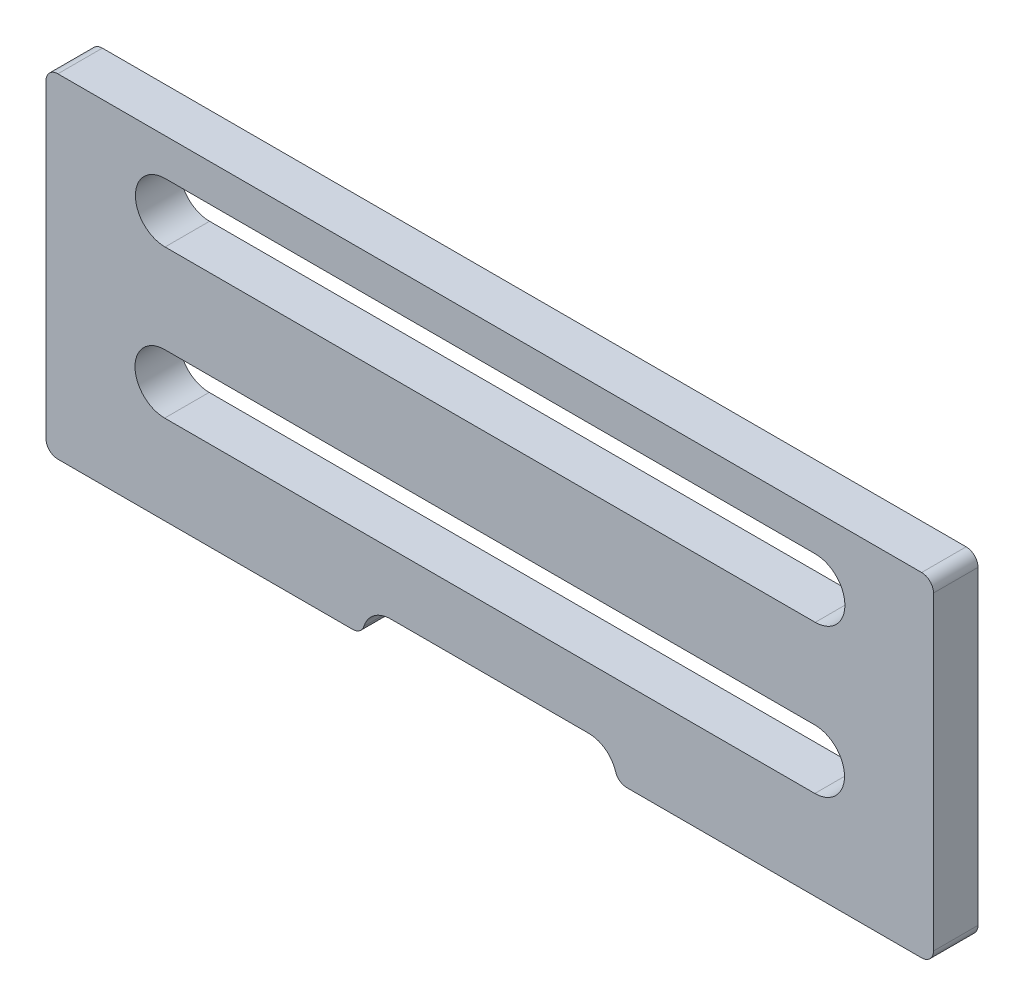
ISO-10303-21;
HEADER;
FILE_DESCRIPTION(('STEP AP214'),'2;1');
FILE_NAME('part.step','',(''),(''),'','','');
FILE_SCHEMA(('AUTOMOTIVE_DESIGN { 1 0 10303 214 1 1 1 1 }'));
ENDSEC;
DATA;
#1=APPLICATION_CONTEXT('core data for automotive mechanical design processes');
#2=APPLICATION_PROTOCOL_DEFINITION('international standard','automotive_design',2000,#1);
#3=PRODUCT_CONTEXT('',#1,'mechanical');
#4=PRODUCT('Part','Part','',(#3));
#5=PRODUCT_RELATED_PRODUCT_CATEGORY('part','',(#4));
#6=PRODUCT_DEFINITION_FORMATION('','',#4);
#7=PRODUCT_DEFINITION_CONTEXT('part definition',#1,'design');
#8=PRODUCT_DEFINITION('design','',#6,#7);
#9=PRODUCT_DEFINITION_SHAPE('','',#8);
#10=(LENGTH_UNIT() NAMED_UNIT(*) SI_UNIT(.MILLI.,.METRE.));
#11=(NAMED_UNIT(*) PLANE_ANGLE_UNIT() SI_UNIT($,.RADIAN.));
#12=(NAMED_UNIT(*) SI_UNIT($,.STERADIAN.) SOLID_ANGLE_UNIT());
#13=UNCERTAINTY_MEASURE_WITH_UNIT(LENGTH_MEASURE(1.E-05),#10,'distance_accuracy_value','');
#14=(GEOMETRIC_REPRESENTATION_CONTEXT(3) GLOBAL_UNCERTAINTY_ASSIGNED_CONTEXT((#13)) GLOBAL_UNIT_ASSIGNED_CONTEXT((#10,
#11,#12)) REPRESENTATION_CONTEXT('',''));
#15=CARTESIAN_POINT('',(0.,0.,0.));
#16=DIRECTION('',(0.,0.,1.));
#17=DIRECTION('',(1.,0.,0.));
#18=AXIS2_PLACEMENT_3D('',#15,#16,#17);
#19=CARTESIAN_POINT('',(-46.21916,-16.589375,0.));
#20=DIRECTION('',(0.,0.,1.));
#21=DIRECTION('',(1.,0.,0.));
#22=AXIS2_PLACEMENT_3D('',#19,#20,#21);
#23=CYLINDRICAL_SURFACE('',#22,1.27);
#24=CARTESIAN_POINT('',(-46.21916,-16.589375,4.7625));
#25=DIRECTION('',(0.,0.,1.));
#26=DIRECTION('',(1.,0.,0.));
#27=AXIS2_PLACEMENT_3D('',#24,#25,#26);
#28=CIRCLE('',#27,1.27);
#29=CARTESIAN_POINT('',(-47.48916,-16.589375,4.7625));
#30=VERTEX_POINT('',#29);
#31=CARTESIAN_POINT('',(-46.21916,-17.859375,4.7625));
#32=VERTEX_POINT('',#31);
#33=EDGE_CURVE('E284',#30,#32,#28,.T.);
#34=ORIENTED_EDGE('',*,*,#33,.F.);
#35=DIRECTION('',(0.,0.,1.));
#36=VECTOR('',#35,1.);
#37=CARTESIAN_POINT('',(-47.48916,-16.589375,0.));
#38=LINE('',#37,#36);
#39=CARTESIAN_POINT('',(-47.48916,-16.589375,0.));
#40=VERTEX_POINT('',#39);
#41=EDGE_CURVE('E11',#40,#30,#38,.T.);
#42=ORIENTED_EDGE('',*,*,#41,.F.);
#43=CARTESIAN_POINT('',(-46.21916,-16.589375,0.));
#44=DIRECTION('',(0.,0.,1.));
#45=DIRECTION('',(1.,0.,0.));
#46=AXIS2_PLACEMENT_3D('',#43,#44,#45);
#47=CIRCLE('',#46,1.27);
#48=CARTESIAN_POINT('',(-46.21916,-17.859375,0.));
#49=VERTEX_POINT('',#48);
#50=EDGE_CURVE('E294',#40,#49,#47,.T.);
#51=ORIENTED_EDGE('',*,*,#50,.T.);
#52=DIRECTION('',(0.,0.,1.));
#53=VECTOR('',#52,1.);
#54=CARTESIAN_POINT('',(-46.21916,-17.859375,0.));
#55=LINE('',#54,#53);
#56=EDGE_CURVE('E54',#49,#32,#55,.T.);
#57=ORIENTED_EDGE('',*,*,#56,.T.);
#58=EDGE_LOOP('',(#34,#42,#51,#57));
#59=FACE_BOUND('',#58,.T.);
#60=ADVANCED_FACE('F51',(#59),#23,.T.);
#61=CARTESIAN_POINT('',(-47.48916,16.589375,0.));
#62=DIRECTION('',(-1.,0.,0.));
#63=DIRECTION('',(0.,0.,1.));
#64=AXIS2_PLACEMENT_3D('',#61,#62,#63);
#65=PLANE('',#64);
#66=DIRECTION('',(0.,-1.,0.));
#67=VECTOR('',#66,1.);
#68=CARTESIAN_POINT('',(-47.48916,16.589375,4.7625));
#69=LINE('',#68,#67);
#70=CARTESIAN_POINT('',(-47.48916,16.589375,4.7625));
#71=VERTEX_POINT('',#70);
#72=EDGE_CURVE('E299',#71,#30,#69,.T.);
#73=ORIENTED_EDGE('',*,*,#72,.F.);
#74=DIRECTION('',(0.,0.,1.));
#75=VECTOR('',#74,1.);
#76=CARTESIAN_POINT('',(-47.48916,16.589375,0.));
#77=LINE('',#76,#75);
#78=CARTESIAN_POINT('',(-47.48916,16.589375,0.));
#79=VERTEX_POINT('',#78);
#80=EDGE_CURVE('E60',#79,#71,#77,.T.);
#81=ORIENTED_EDGE('',*,*,#80,.F.);
#82=DIRECTION('',(0.,-1.,0.));
#83=VECTOR('',#82,1.);
#84=CARTESIAN_POINT('',(-47.48916,16.589375,0.));
#85=LINE('',#84,#83);
#86=EDGE_CURVE('E347',#79,#40,#85,.T.);
#87=ORIENTED_EDGE('',*,*,#86,.T.);
#88=ORIENTED_EDGE('',*,*,#41,.T.);
#89=EDGE_LOOP('',(#73,#81,#87,#88));
#90=FACE_BOUND('',#89,.T.);
#91=ADVANCED_FACE('F452',(#90),#65,.T.);
#92=CARTESIAN_POINT('',(-46.21916,16.589375,0.));
#93=DIRECTION('',(0.,0.,1.));
#94=DIRECTION('',(1.,0.,0.));
#95=AXIS2_PLACEMENT_3D('',#92,#93,#94);
#96=CYLINDRICAL_SURFACE('',#95,1.27);
#97=CARTESIAN_POINT('',(-46.21916,16.589375,4.7625));
#98=DIRECTION('',(0.,0.,1.));
#99=DIRECTION('',(1.,0.,0.));
#100=AXIS2_PLACEMENT_3D('',#97,#98,#99);
#101=CIRCLE('',#100,1.27);
#102=CARTESIAN_POINT('',(-46.21916,17.859375,4.7625));
#103=VERTEX_POINT('',#102);
#104=EDGE_CURVE('E398',#103,#71,#101,.T.);
#105=ORIENTED_EDGE('',*,*,#104,.F.);
#106=DIRECTION('',(0.,0.,1.));
#107=VECTOR('',#106,1.);
#108=CARTESIAN_POINT('',(-46.21916,17.859375,0.));
#109=LINE('',#108,#107);
#110=CARTESIAN_POINT('',(-46.21916,17.859375,0.));
#111=VERTEX_POINT('',#110);
#112=EDGE_CURVE('E407',#111,#103,#109,.T.);
#113=ORIENTED_EDGE('',*,*,#112,.F.);
#114=CARTESIAN_POINT('',(-46.21916,16.589375,0.));
#115=DIRECTION('',(0.,0.,1.));
#116=DIRECTION('',(1.,0.,0.));
#117=AXIS2_PLACEMENT_3D('',#114,#115,#116);
#118=CIRCLE('',#117,1.27);
#119=EDGE_CURVE('E343',#111,#79,#118,.T.);
#120=ORIENTED_EDGE('',*,*,#119,.T.);
#121=ORIENTED_EDGE('',*,*,#80,.T.);
#122=EDGE_LOOP('',(#105,#113,#120,#121));
#123=FACE_BOUND('',#122,.T.);
#124=ADVANCED_FACE('F496',(#123),#96,.T.);
#125=CARTESIAN_POINT('',(46.21916,17.859375,0.));
#126=DIRECTION('',(0.,1.,0.));
#127=DIRECTION('',(0.,0.,1.));
#128=AXIS2_PLACEMENT_3D('',#125,#126,#127);
#129=PLANE('',#128);
#130=DIRECTION('',(-1.,0.,0.));
#131=VECTOR('',#130,1.);
#132=CARTESIAN_POINT('',(46.21916,17.859375,4.7625));
#133=LINE('',#132,#131);
#134=CARTESIAN_POINT('',(46.21916,17.859375,4.7625));
#135=VERTEX_POINT('',#134);
#136=EDGE_CURVE('E394',#135,#103,#133,.T.);
#137=ORIENTED_EDGE('',*,*,#136,.F.);
#138=DIRECTION('',(0.,0.,1.));
#139=VECTOR('',#138,1.);
#140=CARTESIAN_POINT('',(46.21916,17.859375,0.));
#141=LINE('',#140,#139);
#142=CARTESIAN_POINT('',(46.21916,17.859375,0.));
#143=VERTEX_POINT('',#142);
#144=EDGE_CURVE('E410',#143,#135,#141,.T.);
#145=ORIENTED_EDGE('',*,*,#144,.F.);
#146=DIRECTION('',(-1.,0.,0.));
#147=VECTOR('',#146,1.);
#148=CARTESIAN_POINT('',(46.21916,17.859375,0.));
#149=LINE('',#148,#147);
#150=EDGE_CURVE('E339',#143,#111,#149,.T.);
#151=ORIENTED_EDGE('',*,*,#150,.T.);
#152=ORIENTED_EDGE('',*,*,#112,.T.);
#153=EDGE_LOOP('',(#137,#145,#151,#152));
#154=FACE_BOUND('',#153,.T.);
#155=ADVANCED_FACE('F494',(#154),#129,.T.);
#156=CARTESIAN_POINT('',(46.21916,16.589375,0.));
#157=DIRECTION('',(0.,0.,1.));
#158=DIRECTION('',(1.,0.,0.));
#159=AXIS2_PLACEMENT_3D('',#156,#157,#158);
#160=CYLINDRICAL_SURFACE('',#159,1.27);
#161=CARTESIAN_POINT('',(46.21916,16.589375,4.7625));
#162=DIRECTION('',(0.,0.,1.));
#163=DIRECTION('',(1.,0.,0.));
#164=AXIS2_PLACEMENT_3D('',#161,#162,#163);
#165=CIRCLE('',#164,1.27);
#166=CARTESIAN_POINT('',(47.48916,16.589375,4.7625));
#167=VERTEX_POINT('',#166);
#168=EDGE_CURVE('E390',#167,#135,#165,.T.);
#169=ORIENTED_EDGE('',*,*,#168,.F.);
#170=DIRECTION('',(0.,0.,1.));
#171=VECTOR('',#170,1.);
#172=CARTESIAN_POINT('',(47.48916,16.589375,0.));
#173=LINE('',#172,#171);
#174=CARTESIAN_POINT('',(47.48916,16.589375,0.));
#175=VERTEX_POINT('',#174);
#176=EDGE_CURVE('E413',#175,#167,#173,.T.);
#177=ORIENTED_EDGE('',*,*,#176,.F.);
#178=CARTESIAN_POINT('',(46.21916,16.589375,0.));
#179=DIRECTION('',(0.,0.,1.));
#180=DIRECTION('',(1.,0.,0.));
#181=AXIS2_PLACEMENT_3D('',#178,#179,#180);
#182=CIRCLE('',#181,1.27);
#183=EDGE_CURVE('E335',#175,#143,#182,.T.);
#184=ORIENTED_EDGE('',*,*,#183,.T.);
#185=ORIENTED_EDGE('',*,*,#144,.T.);
#186=EDGE_LOOP('',(#169,#177,#184,#185));
#187=FACE_BOUND('',#186,.T.);
#188=ADVANCED_FACE('F490',(#187),#160,.T.);
#189=CARTESIAN_POINT('',(47.48916,-16.589375,0.));
#190=DIRECTION('',(1.,0.,0.));
#191=DIRECTION('',(0.,0.,-1.));
#192=AXIS2_PLACEMENT_3D('',#189,#190,#191);
#193=PLANE('',#192);
#194=DIRECTION('',(0.,1.,0.));
#195=VECTOR('',#194,1.);
#196=CARTESIAN_POINT('',(47.48916,-16.589375,4.7625));
#197=LINE('',#196,#195);
#198=CARTESIAN_POINT('',(47.48916,-16.589375,4.7625));
#199=VERTEX_POINT('',#198);
#200=EDGE_CURVE('E386',#199,#167,#197,.T.);
#201=ORIENTED_EDGE('',*,*,#200,.F.);
#202=DIRECTION('',(0.,0.,1.));
#203=VECTOR('',#202,1.);
#204=CARTESIAN_POINT('',(47.48916,-16.589375,0.));
#205=LINE('',#204,#203);
#206=CARTESIAN_POINT('',(47.48916,-16.589375,0.));
#207=VERTEX_POINT('',#206);
#208=EDGE_CURVE('E416',#207,#199,#205,.T.);
#209=ORIENTED_EDGE('',*,*,#208,.F.);
#210=DIRECTION('',(0.,1.,0.));
#211=VECTOR('',#210,1.);
#212=CARTESIAN_POINT('',(47.48916,-16.589375,0.));
#213=LINE('',#212,#211);
#214=EDGE_CURVE('E331',#207,#175,#213,.T.);
#215=ORIENTED_EDGE('',*,*,#214,.T.);
#216=ORIENTED_EDGE('',*,*,#176,.T.);
#217=EDGE_LOOP('',(#201,#209,#215,#216));
#218=FACE_BOUND('',#217,.T.);
#219=ADVANCED_FACE('F486',(#218),#193,.T.);
#220=CARTESIAN_POINT('',(46.21916,-16.589375,0.));
#221=DIRECTION('',(0.,0.,1.));
#222=DIRECTION('',(1.,0.,0.));
#223=AXIS2_PLACEMENT_3D('',#220,#221,#222);
#224=CYLINDRICAL_SURFACE('',#223,1.27);
#225=CARTESIAN_POINT('',(46.21916,-16.589375,4.7625));
#226=DIRECTION('',(0.,0.,1.));
#227=DIRECTION('',(1.,0.,0.));
#228=AXIS2_PLACEMENT_3D('',#225,#226,#227);
#229=CIRCLE('',#228,1.27);
#230=CARTESIAN_POINT('',(46.21916,-17.859375,4.7625));
#231=VERTEX_POINT('',#230);
#232=EDGE_CURVE('E382',#231,#199,#229,.T.);
#233=ORIENTED_EDGE('',*,*,#232,.F.);
#234=DIRECTION('',(0.,0.,1.));
#235=VECTOR('',#234,1.);
#236=CARTESIAN_POINT('',(46.21916,-17.859375,0.));
#237=LINE('',#236,#235);
#238=CARTESIAN_POINT('',(46.21916,-17.859375,0.));
#239=VERTEX_POINT('',#238);
#240=EDGE_CURVE('E419',#239,#231,#237,.T.);
#241=ORIENTED_EDGE('',*,*,#240,.F.);
#242=CARTESIAN_POINT('',(46.21916,-16.589375,0.));
#243=DIRECTION('',(0.,0.,1.));
#244=DIRECTION('',(1.,0.,0.));
#245=AXIS2_PLACEMENT_3D('',#242,#243,#244);
#246=CIRCLE('',#245,1.27);
#247=EDGE_CURVE('E327',#239,#207,#246,.T.);
#248=ORIENTED_EDGE('',*,*,#247,.T.);
#249=ORIENTED_EDGE('',*,*,#208,.T.);
#250=EDGE_LOOP('',(#233,#241,#248,#249));
#251=FACE_BOUND('',#250,.T.);
#252=ADVANCED_FACE('F482',(#251),#224,.T.);
#253=CARTESIAN_POINT('',(14.6767634221279,-17.859375,0.));
#254=DIRECTION('',(0.,-1.,0.));
#255=DIRECTION('',(0.,0.,-1.));
#256=AXIS2_PLACEMENT_3D('',#253,#254,#255);
#257=PLANE('',#256);
#258=DIRECTION('',(1.,0.,0.));
#259=VECTOR('',#258,1.);
#260=CARTESIAN_POINT('',(14.6767634221279,-17.859375,4.7625));
#261=LINE('',#260,#259);
#262=CARTESIAN_POINT('',(14.6767634221279,-17.859375,4.7625));
#263=VERTEX_POINT('',#262);
#264=EDGE_CURVE('E378',#263,#231,#261,.T.);
#265=ORIENTED_EDGE('',*,*,#264,.F.);
#266=DIRECTION('',(0.,0.,1.));
#267=VECTOR('',#266,1.);
#268=CARTESIAN_POINT('',(14.6767634221279,-17.859375,0.));
#269=LINE('',#268,#267);
#270=CARTESIAN_POINT('',(14.6767634221279,-17.859375,0.));
#271=VERTEX_POINT('',#270);
#272=EDGE_CURVE('E422',#271,#263,#269,.T.);
#273=ORIENTED_EDGE('',*,*,#272,.F.);
#274=DIRECTION('',(1.,0.,0.));
#275=VECTOR('',#274,1.);
#276=CARTESIAN_POINT('',(14.6767634221279,-17.859375,0.));
#277=LINE('',#276,#275);
#278=EDGE_CURVE('E323',#271,#239,#277,.T.);
#279=ORIENTED_EDGE('',*,*,#278,.T.);
#280=ORIENTED_EDGE('',*,*,#240,.T.);
#281=EDGE_LOOP('',(#265,#273,#279,#280));
#282=FACE_BOUND('',#281,.T.);
#283=ADVANCED_FACE('F478',(#282),#257,.T.);
#284=CARTESIAN_POINT('',(14.6767634221279,-16.589375,0.));
#285=DIRECTION('',(0.,0.,1.));
#286=DIRECTION('',(1.,0.,0.));
#287=AXIS2_PLACEMENT_3D('',#284,#285,#286);
#288=CYLINDRICAL_SURFACE('',#287,1.27000000000001);
#289=CARTESIAN_POINT('',(14.6767634221279,-16.589375,4.7625));
#290=DIRECTION('',(0.,0.,1.));
#291=DIRECTION('',(1.,0.,0.));
#292=AXIS2_PLACEMENT_3D('',#289,#290,#291);
#293=CIRCLE('',#292,1.27000000000001);
#294=CARTESIAN_POINT('',(13.4642365963428,-16.9671033372365,4.7625));
#295=VERTEX_POINT('',#294);
#296=EDGE_CURVE('E374',#295,#263,#293,.T.);
#297=ORIENTED_EDGE('',*,*,#296,.F.);
#298=DIRECTION('',(0.,0.,1.));
#299=VECTOR('',#298,1.);
#300=CARTESIAN_POINT('',(13.4642365963428,-16.9671033372365,0.));
#301=LINE('',#300,#299);
#302=CARTESIAN_POINT('',(13.4642365963428,-16.9671033372365,0.));
#303=VERTEX_POINT('',#302);
#304=EDGE_CURVE('E425',#303,#295,#301,.T.);
#305=ORIENTED_EDGE('',*,*,#304,.F.);
#306=CARTESIAN_POINT('',(14.6767634221279,-16.589375,0.));
#307=DIRECTION('',(0.,0.,1.));
#308=DIRECTION('',(1.,0.,0.));
#309=AXIS2_PLACEMENT_3D('',#306,#307,#308);
#310=CIRCLE('',#309,1.27000000000001);
#311=EDGE_CURVE('E319',#303,#271,#310,.T.);
#312=ORIENTED_EDGE('',*,*,#311,.T.);
#313=ORIENTED_EDGE('',*,*,#272,.T.);
#314=EDGE_LOOP('',(#297,#305,#312,#313));
#315=FACE_BOUND('',#314,.T.);
#316=ADVANCED_FACE('F474',(#315),#288,.T.);
#317=CARTESIAN_POINT('',(10.6,-17.859375,0.));
#318=DIRECTION('',(0.,0.,1.));
#319=DIRECTION('',(1.,0.,0.));
#320=AXIS2_PLACEMENT_3D('',#317,#318,#319);
#321=CYLINDRICAL_SURFACE('',#320,2.99999999999999);
#322=CARTESIAN_POINT('',(10.6,-17.859375,4.7625));
#323=DIRECTION('',(0.,0.,-1.));
#324=DIRECTION('',(-1.,0.,0.));
#325=AXIS2_PLACEMENT_3D('',#322,#323,#324);
#326=CIRCLE('',#325,2.99999999999999);
#327=CARTESIAN_POINT('',(10.6,-14.859375,4.7625));
#328=VERTEX_POINT('',#327);
#329=EDGE_CURVE('E370',#328,#295,#326,.T.);
#330=ORIENTED_EDGE('',*,*,#329,.F.);
#331=DIRECTION('',(0.,0.,1.));
#332=VECTOR('',#331,1.);
#333=CARTESIAN_POINT('',(10.6,-14.859375,0.));
#334=LINE('',#333,#332);
#335=CARTESIAN_POINT('',(10.6,-14.859375,0.));
#336=VERTEX_POINT('',#335);
#337=EDGE_CURVE('E428',#336,#328,#334,.T.);
#338=ORIENTED_EDGE('',*,*,#337,.F.);
#339=CARTESIAN_POINT('',(10.6,-17.859375,0.));
#340=DIRECTION('',(0.,0.,-1.));
#341=DIRECTION('',(-1.,0.,0.));
#342=AXIS2_PLACEMENT_3D('',#339,#340,#341);
#343=CIRCLE('',#342,2.99999999999999);
#344=EDGE_CURVE('E315',#336,#303,#343,.T.);
#345=ORIENTED_EDGE('',*,*,#344,.T.);
#346=ORIENTED_EDGE('',*,*,#304,.T.);
#347=EDGE_LOOP('',(#330,#338,#345,#346));
#348=FACE_BOUND('',#347,.T.);
#349=ADVANCED_FACE('F470',(#348),#321,.F.);
#350=CARTESIAN_POINT('',(-10.6,-14.859375,0.));
#351=DIRECTION('',(0.,-1.,0.));
#352=DIRECTION('',(0.,0.,-1.));
#353=AXIS2_PLACEMENT_3D('',#350,#351,#352);
#354=PLANE('',#353);
#355=DIRECTION('',(1.,0.,0.));
#356=VECTOR('',#355,1.);
#357=CARTESIAN_POINT('',(-10.6,-14.859375,4.7625));
#358=LINE('',#357,#356);
#359=CARTESIAN_POINT('',(-10.6,-14.859375,4.7625));
#360=VERTEX_POINT('',#359);
#361=EDGE_CURVE('E366',#360,#328,#358,.T.);
#362=ORIENTED_EDGE('',*,*,#361,.F.);
#363=DIRECTION('',(0.,0.,1.));
#364=VECTOR('',#363,1.);
#365=CARTESIAN_POINT('',(-10.6,-14.859375,0.));
#366=LINE('',#365,#364);
#367=CARTESIAN_POINT('',(-10.6,-14.859375,0.));
#368=VERTEX_POINT('',#367);
#369=EDGE_CURVE('E431',#368,#360,#366,.T.);
#370=ORIENTED_EDGE('',*,*,#369,.F.);
#371=DIRECTION('',(1.,0.,0.));
#372=VECTOR('',#371,1.);
#373=CARTESIAN_POINT('',(-10.6,-14.859375,0.));
#374=LINE('',#373,#372);
#375=EDGE_CURVE('E311',#368,#336,#374,.T.);
#376=ORIENTED_EDGE('',*,*,#375,.T.);
#377=ORIENTED_EDGE('',*,*,#337,.T.);
#378=EDGE_LOOP('',(#362,#370,#376,#377));
#379=FACE_BOUND('',#378,.T.);
#380=ADVANCED_FACE('F466',(#379),#354,.T.);
#381=CARTESIAN_POINT('',(-10.6,-17.859375,0.));
#382=DIRECTION('',(0.,0.,1.));
#383=DIRECTION('',(1.,0.,0.));
#384=AXIS2_PLACEMENT_3D('',#381,#382,#383);
#385=CYLINDRICAL_SURFACE('',#384,2.99999999999999);
#386=CARTESIAN_POINT('',(-10.6,-17.859375,4.7625));
#387=DIRECTION('',(0.,0.,-1.));
#388=DIRECTION('',(-1.,0.,0.));
#389=AXIS2_PLACEMENT_3D('',#386,#387,#388);
#390=CIRCLE('',#389,2.99999999999999);
#391=CARTESIAN_POINT('',(-13.4642365963428,-16.9671033372365,4.7625));
#392=VERTEX_POINT('',#391);
#393=EDGE_CURVE('E362',#392,#360,#390,.T.);
#394=ORIENTED_EDGE('',*,*,#393,.F.);
#395=DIRECTION('',(0.,0.,1.));
#396=VECTOR('',#395,1.);
#397=CARTESIAN_POINT('',(-13.4642365963428,-16.9671033372365,0.));
#398=LINE('',#397,#396);
#399=CARTESIAN_POINT('',(-13.4642365963428,-16.9671033372365,0.));
#400=VERTEX_POINT('',#399);
#401=EDGE_CURVE('E434',#400,#392,#398,.T.);
#402=ORIENTED_EDGE('',*,*,#401,.F.);
#403=CARTESIAN_POINT('',(-10.6,-17.859375,0.));
#404=DIRECTION('',(0.,0.,-1.));
#405=DIRECTION('',(-1.,0.,0.));
#406=AXIS2_PLACEMENT_3D('',#403,#404,#405);
#407=CIRCLE('',#406,2.99999999999999);
#408=EDGE_CURVE('E307',#400,#368,#407,.T.);
#409=ORIENTED_EDGE('',*,*,#408,.T.);
#410=ORIENTED_EDGE('',*,*,#369,.T.);
#411=EDGE_LOOP('',(#394,#402,#409,#410));
#412=FACE_BOUND('',#411,.T.);
#413=ADVANCED_FACE('F464',(#412),#385,.F.);
#414=CARTESIAN_POINT('',(-14.6767634221279,-16.589375,0.));
#415=DIRECTION('',(0.,0.,1.));
#416=DIRECTION('',(1.,0.,0.));
#417=AXIS2_PLACEMENT_3D('',#414,#415,#416);
#418=CYLINDRICAL_SURFACE('',#417,1.27000000000001);
#419=CARTESIAN_POINT('',(-14.6767634221279,-16.589375,4.7625));
#420=DIRECTION('',(0.,0.,1.));
#421=DIRECTION('',(1.,0.,0.));
#422=AXIS2_PLACEMENT_3D('',#419,#420,#421);
#423=CIRCLE('',#422,1.27000000000001);
#424=CARTESIAN_POINT('',(-14.6767634221279,-17.859375,4.7625));
#425=VERTEX_POINT('',#424);
#426=EDGE_CURVE('E358',#425,#392,#423,.T.);
#427=ORIENTED_EDGE('',*,*,#426,.F.);
#428=DIRECTION('',(0.,0.,1.));
#429=VECTOR('',#428,1.);
#430=CARTESIAN_POINT('',(-14.6767634221279,-17.859375,0.));
#431=LINE('',#430,#429);
#432=CARTESIAN_POINT('',(-14.6767634221279,-17.859375,0.));
#433=VERTEX_POINT('',#432);
#434=EDGE_CURVE('E436',#433,#425,#431,.T.);
#435=ORIENTED_EDGE('',*,*,#434,.F.);
#436=CARTESIAN_POINT('',(-14.6767634221279,-16.589375,0.));
#437=DIRECTION('',(0.,0.,1.));
#438=DIRECTION('',(1.,0.,0.));
#439=AXIS2_PLACEMENT_3D('',#436,#437,#438);
#440=CIRCLE('',#439,1.27000000000001);
#441=EDGE_CURVE('E303',#433,#400,#440,.T.);
#442=ORIENTED_EDGE('',*,*,#441,.T.);
#443=ORIENTED_EDGE('',*,*,#401,.T.);
#444=EDGE_LOOP('',(#427,#435,#442,#443));
#445=FACE_BOUND('',#444,.T.);
#446=ADVANCED_FACE('F460',(#445),#418,.T.);
#447=CARTESIAN_POINT('',(-46.21916,-17.859375,0.));
#448=DIRECTION('',(0.,-1.,0.));
#449=DIRECTION('',(0.,0.,-1.));
#450=AXIS2_PLACEMENT_3D('',#447,#448,#449);
#451=PLANE('',#450);
#452=DIRECTION('',(1.,0.,0.));
#453=VECTOR('',#452,1.);
#454=CARTESIAN_POINT('',(-46.21916,-17.859375,4.7625));
#455=LINE('',#454,#453);
#456=EDGE_CURVE('E354',#32,#425,#455,.T.);
#457=ORIENTED_EDGE('',*,*,#456,.F.);
#458=ORIENTED_EDGE('',*,*,#56,.F.);
#459=DIRECTION('',(1.,0.,0.));
#460=VECTOR('',#459,1.);
#461=CARTESIAN_POINT('',(-46.21916,-17.859375,0.));
#462=LINE('',#461,#460);
#463=EDGE_CURVE('E298',#49,#433,#462,.T.);
#464=ORIENTED_EDGE('',*,*,#463,.T.);
#465=ORIENTED_EDGE('',*,*,#434,.T.);
#466=EDGE_LOOP('',(#457,#458,#464,#465));
#467=FACE_BOUND('',#466,.T.);
#468=ADVANCED_FACE('F446',(#467),#451,.T.);
#469=CARTESIAN_POINT('',(-46.21916,-16.589375,0.));
#470=DIRECTION('',(0.,0.,1.));
#471=DIRECTION('',(1.,0.,0.));
#472=AXIS2_PLACEMENT_3D('',#469,#470,#471);
#473=PLANE('',#472);
#474=DIRECTION('',(1.,0.,0.));
#475=VECTOR('',#474,1.);
#476=CARTESIAN_POINT('',(34.8316655004598,7.546875,0.));
#477=LINE('',#476,#475);
#478=CARTESIAN_POINT('',(-34.7466544995402,7.54687499999999,0.));
#479=VERTEX_POINT('',#478);
#480=CARTESIAN_POINT('',(34.8316655004598,7.546875,0.));
#481=VERTEX_POINT('',#480);
#482=EDGE_CURVE('E210',#479,#481,#477,.T.);
#483=ORIENTED_EDGE('',*,*,#482,.T.);
#484=CARTESIAN_POINT('',(34.8316655004598,10.721875,0.));
#485=DIRECTION('',(0.,0.,1.));
#486=DIRECTION('',(-1.,0.,0.));
#487=AXIS2_PLACEMENT_3D('',#484,#485,#486);
#488=CIRCLE('',#487,3.175);
#489=CARTESIAN_POINT('',(34.8316655004598,13.896875,0.));
#490=VERTEX_POINT('',#489);
#491=EDGE_CURVE('E203',#481,#490,#488,.T.);
#492=ORIENTED_EDGE('',*,*,#491,.T.);
#493=DIRECTION('',(-1.,0.,0.));
#494=VECTOR('',#493,1.);
#495=CARTESIAN_POINT('',(-34.7466544995402,13.896875,0.));
#496=LINE('',#495,#494);
#497=CARTESIAN_POINT('',(-34.7466544995402,13.896875,0.));
#498=VERTEX_POINT('',#497);
#499=EDGE_CURVE('E213',#490,#498,#496,.T.);
#500=ORIENTED_EDGE('',*,*,#499,.T.);
#501=CARTESIAN_POINT('',(-34.7466544995402,10.721875,0.));
#502=DIRECTION('',(0.,0.,1.));
#503=DIRECTION('',(-1.,0.,0.));
#504=AXIS2_PLACEMENT_3D('',#501,#502,#503);
#505=CIRCLE('',#504,3.17499999999999);
#506=EDGE_CURVE('E68',#498,#479,#505,.T.);
#507=ORIENTED_EDGE('',*,*,#506,.T.);
#508=EDGE_LOOP('',(#483,#492,#500,#507));
#509=FACE_BOUND('',#508,.T.);
#510=DIRECTION('',(1.,0.,0.));
#511=VECTOR('',#510,1.);
#512=CARTESIAN_POINT('',(34.78916,-8.334375,0.));
#513=LINE('',#512,#511);
#514=CARTESIAN_POINT('',(-34.78916,-8.334375,0.));
#515=VERTEX_POINT('',#514);
#516=CARTESIAN_POINT('',(34.78916,-8.334375,0.));
#517=VERTEX_POINT('',#516);
#518=EDGE_CURVE('E263',#515,#517,#513,.T.);
#519=ORIENTED_EDGE('',*,*,#518,.T.);
#520=CARTESIAN_POINT('',(34.78916,-5.159375,0.));
#521=DIRECTION('',(0.,0.,1.));
#522=DIRECTION('',(-1.,0.,0.));
#523=AXIS2_PLACEMENT_3D('',#520,#521,#522);
#524=CIRCLE('',#523,3.175);
#525=CARTESIAN_POINT('',(34.78916,-1.984375,0.));
#526=VERTEX_POINT('',#525);
#527=EDGE_CURVE('E250',#517,#526,#524,.T.);
#528=ORIENTED_EDGE('',*,*,#527,.T.);
#529=DIRECTION('',(-1.,0.,0.));
#530=VECTOR('',#529,1.);
#531=CARTESIAN_POINT('',(-34.78916,-1.984375,0.));
#532=LINE('',#531,#530);
#533=CARTESIAN_POINT('',(-34.78916,-1.984375,0.));
#534=VERTEX_POINT('',#533);
#535=EDGE_CURVE('E254',#526,#534,#532,.T.);
#536=ORIENTED_EDGE('',*,*,#535,.T.);
#537=CARTESIAN_POINT('',(-34.78916,-5.159375,0.));
#538=DIRECTION('',(0.,0.,1.));
#539=DIRECTION('',(-1.,0.,0.));
#540=AXIS2_PLACEMENT_3D('',#537,#538,#539);
#541=CIRCLE('',#540,3.175);
#542=EDGE_CURVE('E259',#534,#515,#541,.T.);
#543=ORIENTED_EDGE('',*,*,#542,.T.);
#544=EDGE_LOOP('',(#519,#528,#536,#543));
#545=FACE_BOUND('',#544,.T.);
#546=ORIENTED_EDGE('',*,*,#50,.F.);
#547=ORIENTED_EDGE('',*,*,#86,.F.);
#548=ORIENTED_EDGE('',*,*,#119,.F.);
#549=ORIENTED_EDGE('',*,*,#150,.F.);
#550=ORIENTED_EDGE('',*,*,#183,.F.);
#551=ORIENTED_EDGE('',*,*,#214,.F.);
#552=ORIENTED_EDGE('',*,*,#247,.F.);
#553=ORIENTED_EDGE('',*,*,#278,.F.);
#554=ORIENTED_EDGE('',*,*,#311,.F.);
#555=ORIENTED_EDGE('',*,*,#344,.F.);
#556=ORIENTED_EDGE('',*,*,#375,.F.);
#557=ORIENTED_EDGE('',*,*,#408,.F.);
#558=ORIENTED_EDGE('',*,*,#441,.F.);
#559=ORIENTED_EDGE('',*,*,#463,.F.);
#560=EDGE_LOOP('',(#546,#547,#548,#549,#550,#551,#552,#553,#554,#555,#556,#557,#558,#559));
#561=FACE_BOUND('',#560,.T.);
#562=ADVANCED_FACE('F218',(#509,#545,#561),#473,.F.);
#563=CARTESIAN_POINT('',(-46.21916,-16.589375,4.7625));
#564=DIRECTION('',(0.,0.,1.));
#565=DIRECTION('',(1.,0.,0.));
#566=AXIS2_PLACEMENT_3D('',#563,#564,#565);
#567=PLANE('',#566);
#568=CARTESIAN_POINT('',(34.8316655004598,10.721875,4.7625));
#569=DIRECTION('',(0.,0.,1.));
#570=DIRECTION('',(-1.,0.,0.));
#571=AXIS2_PLACEMENT_3D('',#568,#569,#570);
#572=CIRCLE('',#571,3.175);
#573=CARTESIAN_POINT('',(34.8316655004598,7.546875,4.7625));
#574=VERTEX_POINT('',#573);
#575=CARTESIAN_POINT('',(34.8316655004598,13.896875,4.7625));
#576=VERTEX_POINT('',#575);
#577=EDGE_CURVE('E76',#574,#576,#572,.T.);
#578=ORIENTED_EDGE('',*,*,#577,.F.);
#579=DIRECTION('',(1.,0.,0.));
#580=VECTOR('',#579,1.);
#581=CARTESIAN_POINT('',(34.8316655004598,7.546875,4.7625));
#582=LINE('',#581,#580);
#583=CARTESIAN_POINT('',(-34.7466544995402,7.54687499999999,4.7625));
#584=VERTEX_POINT('',#583);
#585=EDGE_CURVE('E222',#584,#574,#582,.T.);
#586=ORIENTED_EDGE('',*,*,#585,.F.);
#587=CARTESIAN_POINT('',(-34.7466544995402,10.721875,4.7625));
#588=DIRECTION('',(0.,0.,1.));
#589=DIRECTION('',(-1.,0.,0.));
#590=AXIS2_PLACEMENT_3D('',#587,#588,#589);
#591=CIRCLE('',#590,3.17499999999999);
#592=CARTESIAN_POINT('',(-34.7466544995402,13.896875,4.7625));
#593=VERTEX_POINT('',#592);
#594=EDGE_CURVE('E226',#593,#584,#591,.T.);
#595=ORIENTED_EDGE('',*,*,#594,.F.);
#596=DIRECTION('',(-1.,0.,0.));
#597=VECTOR('',#596,1.);
#598=CARTESIAN_POINT('',(-34.7466544995402,13.896875,4.7625));
#599=LINE('',#598,#597);
#600=EDGE_CURVE('E235',#576,#593,#599,.T.);
#601=ORIENTED_EDGE('',*,*,#600,.F.);
#602=EDGE_LOOP('',(#578,#586,#595,#601));
#603=FACE_BOUND('',#602,.T.);
#604=CARTESIAN_POINT('',(34.78916,-5.159375,4.7625));
#605=DIRECTION('',(0.,0.,1.));
#606=DIRECTION('',(-1.,0.,0.));
#607=AXIS2_PLACEMENT_3D('',#604,#605,#606);
#608=CIRCLE('',#607,3.175);
#609=CARTESIAN_POINT('',(34.78916,-8.334375,4.7625));
#610=VERTEX_POINT('',#609);
#611=CARTESIAN_POINT('',(34.78916,-1.984375,4.7625));
#612=VERTEX_POINT('',#611);
#613=EDGE_CURVE('E244',#610,#612,#608,.T.);
#614=ORIENTED_EDGE('',*,*,#613,.F.);
#615=DIRECTION('',(1.,0.,0.));
#616=VECTOR('',#615,1.);
#617=CARTESIAN_POINT('',(34.78916,-8.334375,4.7625));
#618=LINE('',#617,#616);
#619=CARTESIAN_POINT('',(-34.78916,-8.334375,4.7625));
#620=VERTEX_POINT('',#619);
#621=EDGE_CURVE('E255',#620,#610,#618,.T.);
#622=ORIENTED_EDGE('',*,*,#621,.F.);
#623=CARTESIAN_POINT('',(-34.78916,-5.159375,4.7625));
#624=DIRECTION('',(0.,0.,1.));
#625=DIRECTION('',(-1.,0.,0.));
#626=AXIS2_PLACEMENT_3D('',#623,#624,#625);
#627=CIRCLE('',#626,3.175);
#628=CARTESIAN_POINT('',(-34.78916,-1.984375,4.7625));
#629=VERTEX_POINT('',#628);
#630=EDGE_CURVE('E274',#629,#620,#627,.T.);
#631=ORIENTED_EDGE('',*,*,#630,.F.);
#632=DIRECTION('',(-1.,0.,0.));
#633=VECTOR('',#632,1.);
#634=CARTESIAN_POINT('',(-34.78916,-1.984375,4.7625));
#635=LINE('',#634,#633);
#636=EDGE_CURVE('E270',#612,#629,#635,.T.);
#637=ORIENTED_EDGE('',*,*,#636,.F.);
#638=EDGE_LOOP('',(#614,#622,#631,#637));
#639=FACE_BOUND('',#638,.T.);
#640=ORIENTED_EDGE('',*,*,#33,.T.);
#641=ORIENTED_EDGE('',*,*,#456,.T.);
#642=ORIENTED_EDGE('',*,*,#426,.T.);
#643=ORIENTED_EDGE('',*,*,#393,.T.);
#644=ORIENTED_EDGE('',*,*,#361,.T.);
#645=ORIENTED_EDGE('',*,*,#329,.T.);
#646=ORIENTED_EDGE('',*,*,#296,.T.);
#647=ORIENTED_EDGE('',*,*,#264,.T.);
#648=ORIENTED_EDGE('',*,*,#232,.T.);
#649=ORIENTED_EDGE('',*,*,#200,.T.);
#650=ORIENTED_EDGE('',*,*,#168,.T.);
#651=ORIENTED_EDGE('',*,*,#136,.T.);
#652=ORIENTED_EDGE('',*,*,#104,.T.);
#653=ORIENTED_EDGE('',*,*,#72,.T.);
#654=EDGE_LOOP('',(#640,#641,#642,#643,#644,#645,#646,#647,#648,#649,#650,#651,#652,#653));
#655=FACE_BOUND('',#654,.T.);
#656=ADVANCED_FACE('F448',(#603,#639,#655),#567,.T.);
#657=CARTESIAN_POINT('',(34.78916,-5.159375,0.));
#658=DIRECTION('',(0.,0.,1.));
#659=DIRECTION('',(1.,0.,0.));
#660=AXIS2_PLACEMENT_3D('',#657,#658,#659);
#661=CYLINDRICAL_SURFACE('',#660,3.175);
#662=ORIENTED_EDGE('',*,*,#613,.T.);
#663=DIRECTION('',(0.,0.,1.));
#664=VECTOR('',#663,1.);
#665=CARTESIAN_POINT('',(34.78916,-1.984375,0.));
#666=LINE('',#665,#664);
#667=EDGE_CURVE('E267',#526,#612,#666,.T.);
#668=ORIENTED_EDGE('',*,*,#667,.F.);
#669=ORIENTED_EDGE('',*,*,#527,.F.);
#670=DIRECTION('',(0.,0.,1.));
#671=VECTOR('',#670,1.);
#672=CARTESIAN_POINT('',(34.78916,-8.334375,0.));
#673=LINE('',#672,#671);
#674=EDGE_CURVE('E281',#517,#610,#673,.T.);
#675=ORIENTED_EDGE('',*,*,#674,.T.);
#676=EDGE_LOOP('',(#662,#668,#669,#675));
#677=FACE_BOUND('',#676,.T.);
#678=ADVANCED_FACE('F617',(#677),#661,.F.);
#679=CARTESIAN_POINT('',(34.78916,-8.334375,0.));
#680=DIRECTION('',(0.,-1.,0.));
#681=DIRECTION('',(0.,0.,-1.));
#682=AXIS2_PLACEMENT_3D('',#679,#680,#681);
#683=PLANE('',#682);
#684=ORIENTED_EDGE('',*,*,#621,.T.);
#685=ORIENTED_EDGE('',*,*,#674,.F.);
#686=ORIENTED_EDGE('',*,*,#518,.F.);
#687=DIRECTION('',(0.,0.,1.));
#688=VECTOR('',#687,1.);
#689=CARTESIAN_POINT('',(-34.78916,-8.334375,0.));
#690=LINE('',#689,#688);
#691=EDGE_CURVE('E285',#515,#620,#690,.T.);
#692=ORIENTED_EDGE('',*,*,#691,.T.);
#693=EDGE_LOOP('',(#684,#685,#686,#692));
#694=FACE_BOUND('',#693,.T.);
#695=ADVANCED_FACE('F626',(#694),#683,.F.);
#696=CARTESIAN_POINT('',(-34.78916,-5.159375,0.));
#697=DIRECTION('',(0.,0.,1.));
#698=DIRECTION('',(1.,0.,0.));
#699=AXIS2_PLACEMENT_3D('',#696,#697,#698);
#700=CYLINDRICAL_SURFACE('',#699,3.175);
#701=ORIENTED_EDGE('',*,*,#630,.T.);
#702=ORIENTED_EDGE('',*,*,#691,.F.);
#703=ORIENTED_EDGE('',*,*,#542,.F.);
#704=DIRECTION('',(0.,0.,1.));
#705=VECTOR('',#704,1.);
#706=CARTESIAN_POINT('',(-34.78916,-1.984375,0.));
#707=LINE('',#706,#705);
#708=EDGE_CURVE('E288',#534,#629,#707,.T.);
#709=ORIENTED_EDGE('',*,*,#708,.T.);
#710=EDGE_LOOP('',(#701,#702,#703,#709));
#711=FACE_BOUND('',#710,.T.);
#712=ADVANCED_FACE('F636',(#711),#700,.F.);
#713=CARTESIAN_POINT('',(-34.78916,-1.984375,0.));
#714=DIRECTION('',(0.,1.,0.));
#715=DIRECTION('',(0.,0.,1.));
#716=AXIS2_PLACEMENT_3D('',#713,#714,#715);
#717=PLANE('',#716);
#718=ORIENTED_EDGE('',*,*,#636,.T.);
#719=ORIENTED_EDGE('',*,*,#708,.F.);
#720=ORIENTED_EDGE('',*,*,#535,.F.);
#721=ORIENTED_EDGE('',*,*,#667,.T.);
#722=EDGE_LOOP('',(#718,#719,#720,#721));
#723=FACE_BOUND('',#722,.T.);
#724=ADVANCED_FACE('F646',(#723),#717,.F.);
#725=CARTESIAN_POINT('',(34.8316655004598,10.721875,0.));
#726=DIRECTION('',(0.,0.,1.));
#727=DIRECTION('',(1.,0.,0.));
#728=AXIS2_PLACEMENT_3D('',#725,#726,#727);
#729=CYLINDRICAL_SURFACE('',#728,3.175);
#730=ORIENTED_EDGE('',*,*,#577,.T.);
#731=DIRECTION('',(0.,0.,1.));
#732=VECTOR('',#731,1.);
#733=CARTESIAN_POINT('',(34.8316655004598,13.896875,0.));
#734=LINE('',#733,#732);
#735=EDGE_CURVE('E199',#490,#576,#734,.T.);
#736=ORIENTED_EDGE('',*,*,#735,.F.);
#737=ORIENTED_EDGE('',*,*,#491,.F.);
#738=DIRECTION('',(0.,0.,1.));
#739=VECTOR('',#738,1.);
#740=CARTESIAN_POINT('',(34.8316655004598,7.546875,0.));
#741=LINE('',#740,#739);
#742=EDGE_CURVE('E241',#481,#574,#741,.T.);
#743=ORIENTED_EDGE('',*,*,#742,.T.);
#744=EDGE_LOOP('',(#730,#736,#737,#743));
#745=FACE_BOUND('',#744,.T.);
#746=ADVANCED_FACE('F201',(#745),#729,.F.);
#747=CARTESIAN_POINT('',(34.8316655004598,7.546875,0.));
#748=DIRECTION('',(0.,-1.,0.));
#749=DIRECTION('',(0.,0.,-1.));
#750=AXIS2_PLACEMENT_3D('',#747,#748,#749);
#751=PLANE('',#750);
#752=ORIENTED_EDGE('',*,*,#585,.T.);
#753=ORIENTED_EDGE('',*,*,#742,.F.);
#754=ORIENTED_EDGE('',*,*,#482,.F.);
#755=DIRECTION('',(0.,0.,1.));
#756=VECTOR('',#755,1.);
#757=CARTESIAN_POINT('',(-34.7466544995402,7.54687499999999,0.));
#758=LINE('',#757,#756);
#759=EDGE_CURVE('E245',#479,#584,#758,.T.);
#760=ORIENTED_EDGE('',*,*,#759,.T.);
#761=EDGE_LOOP('',(#752,#753,#754,#760));
#762=FACE_BOUND('',#761,.T.);
#763=ADVANCED_FACE('F665',(#762),#751,.F.);
#764=CARTESIAN_POINT('',(-34.7466544995402,10.721875,0.));
#765=DIRECTION('',(0.,0.,1.));
#766=DIRECTION('',(1.,0.,0.));
#767=AXIS2_PLACEMENT_3D('',#764,#765,#766);
#768=CYLINDRICAL_SURFACE('',#767,3.17499999999999);
#769=ORIENTED_EDGE('',*,*,#594,.T.);
#770=ORIENTED_EDGE('',*,*,#759,.F.);
#771=ORIENTED_EDGE('',*,*,#506,.F.);
#772=DIRECTION('',(0.,0.,1.));
#773=VECTOR('',#772,1.);
#774=CARTESIAN_POINT('',(-34.7466544995402,13.896875,0.));
#775=LINE('',#774,#773);
#776=EDGE_CURVE('E209',#498,#593,#775,.T.);
#777=ORIENTED_EDGE('',*,*,#776,.T.);
#778=EDGE_LOOP('',(#769,#770,#771,#777));
#779=FACE_BOUND('',#778,.T.);
#780=ADVANCED_FACE('F674',(#779),#768,.F.);
#781=CARTESIAN_POINT('',(-34.7466544995402,13.896875,0.));
#782=DIRECTION('',(0.,1.,0.));
#783=DIRECTION('',(-1.,0.,0.));
#784=AXIS2_PLACEMENT_3D('',#781,#782,#783);
#785=PLANE('',#784);
#786=ORIENTED_EDGE('',*,*,#600,.T.);
#787=ORIENTED_EDGE('',*,*,#776,.F.);
#788=ORIENTED_EDGE('',*,*,#499,.F.);
#789=ORIENTED_EDGE('',*,*,#735,.T.);
#790=EDGE_LOOP('',(#786,#787,#788,#789));
#791=FACE_BOUND('',#790,.T.);
#792=ADVANCED_FACE('F214',(#791),#785,.F.);
#793=CLOSED_SHELL('',(#60,#91,#124,#155,#188,#219,#252,#283,#316,#349,#380,#413,#446,#468,#562,
#656,#678,#695,#712,#724,#746,#763,#780,#792));
#794=MANIFOLD_SOLID_BREP('B2',#793);
#795=ADVANCED_BREP_SHAPE_REPRESENTATION('',(#18,#794),#14);
#796=SHAPE_DEFINITION_REPRESENTATION(#9,#795);
ENDSEC;
END-ISO-10303-21;
